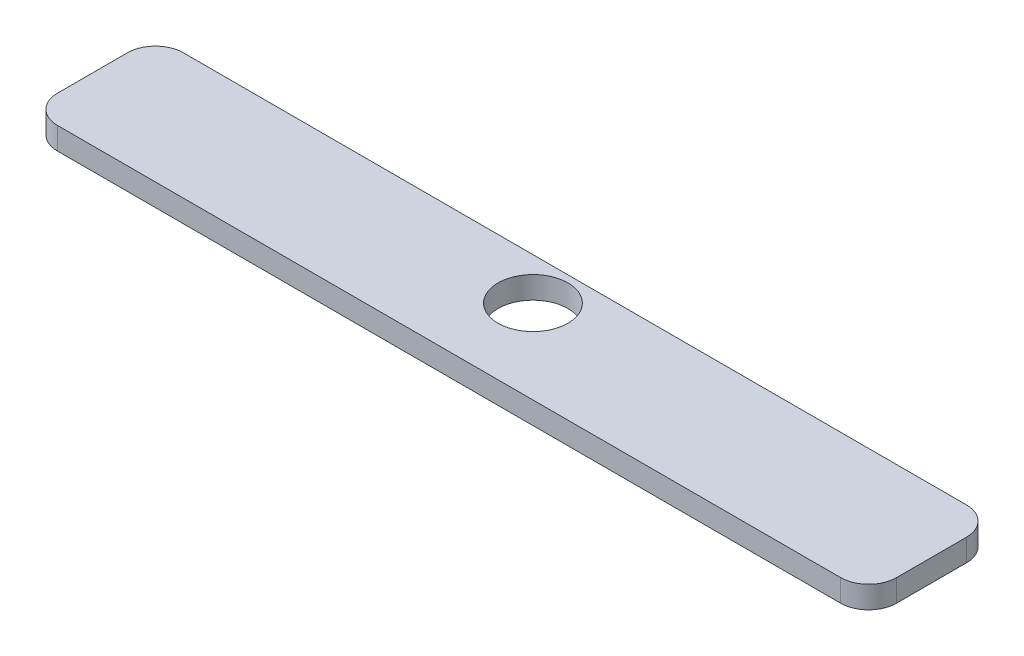
ISO-10303-21;
HEADER;
FILE_DESCRIPTION(('STEP AP214'),'2;1');
FILE_NAME('part.step','',(''),(''),'','','');
FILE_SCHEMA(('AUTOMOTIVE_DESIGN { 1 0 10303 214 1 1 1 1 }'));
ENDSEC;
DATA;
#1=APPLICATION_CONTEXT('core data for automotive mechanical design processes');
#2=APPLICATION_PROTOCOL_DEFINITION('international standard','automotive_design',2000,#1);
#3=PRODUCT_CONTEXT('',#1,'mechanical');
#4=PRODUCT('Part','Part','',(#3));
#5=PRODUCT_RELATED_PRODUCT_CATEGORY('part','',(#4));
#6=PRODUCT_DEFINITION_FORMATION('','',#4);
#7=PRODUCT_DEFINITION_CONTEXT('part definition',#1,'design');
#8=PRODUCT_DEFINITION('design','',#6,#7);
#9=PRODUCT_DEFINITION_SHAPE('','',#8);
#10=(LENGTH_UNIT() NAMED_UNIT(*) SI_UNIT(.MILLI.,.METRE.));
#11=(NAMED_UNIT(*) PLANE_ANGLE_UNIT() SI_UNIT($,.RADIAN.));
#12=(NAMED_UNIT(*) SI_UNIT($,.STERADIAN.) SOLID_ANGLE_UNIT());
#13=UNCERTAINTY_MEASURE_WITH_UNIT(LENGTH_MEASURE(1.E-05),#10,'distance_accuracy_value','');
#14=(GEOMETRIC_REPRESENTATION_CONTEXT(3) GLOBAL_UNCERTAINTY_ASSIGNED_CONTEXT((#13)) GLOBAL_UNIT_ASSIGNED_CONTEXT((#10,
#11,#12)) REPRESENTATION_CONTEXT('',''));
#15=CARTESIAN_POINT('',(0.,0.,0.));
#16=DIRECTION('',(0.,0.,1.));
#17=DIRECTION('',(1.,0.,0.));
#18=AXIS2_PLACEMENT_3D('',#15,#16,#17);
#19=CARTESIAN_POINT('',(0.,0.79375,0.));
#20=DIRECTION('',(0.,-1.,0.));
#21=DIRECTION('',(0.,0.,-1.));
#22=AXIS2_PLACEMENT_3D('',#19,#20,#21);
#23=PLANE('',#22);
#24=DIRECTION('',(0.,0.,-1.));
#25=VECTOR('',#24,1.);
#26=CARTESIAN_POINT('',(30.,0.79375,0.));
#27=LINE('',#26,#25);
#28=CARTESIAN_POINT('',(30.,0.79375,-1.));
#29=VERTEX_POINT('',#28);
#30=CARTESIAN_POINT('',(30.,0.79375,-3.5));
#31=VERTEX_POINT('',#30);
#32=EDGE_CURVE('E200',#29,#31,#27,.T.);
#33=ORIENTED_EDGE('',*,*,#32,.T.);
#34=CARTESIAN_POINT('',(29.,0.79375,-3.5));
#35=DIRECTION('',(0.,-1.,0.));
#36=DIRECTION('',(0.,0.,-1.));
#37=AXIS2_PLACEMENT_3D('',#34,#35,#36);
#38=CIRCLE('',#37,1.);
#39=CARTESIAN_POINT('',(29.,0.79375,-4.5));
#40=VERTEX_POINT('',#39);
#41=EDGE_CURVE('E169',#31,#40,#38,.F.);
#42=ORIENTED_EDGE('',*,*,#41,.T.);
#43=DIRECTION('',(-1.,0.,0.));
#44=VECTOR('',#43,1.);
#45=CARTESIAN_POINT('',(0.,0.79375,-4.5));
#46=LINE('',#45,#44);
#47=CARTESIAN_POINT('',(1.,0.79375,-4.5));
#48=VERTEX_POINT('',#47);
#49=EDGE_CURVE('E127',#40,#48,#46,.T.);
#50=ORIENTED_EDGE('',*,*,#49,.T.);
#51=CARTESIAN_POINT('',(1.,0.79375,-3.5));
#52=DIRECTION('',(0.,-1.,0.));
#53=DIRECTION('',(0.,0.,-1.));
#54=AXIS2_PLACEMENT_3D('',#51,#52,#53);
#55=CIRCLE('',#54,1.);
#56=CARTESIAN_POINT('',(0.,0.79375,-3.5));
#57=VERTEX_POINT('',#56);
#58=EDGE_CURVE('E161',#48,#57,#55,.F.);
#59=ORIENTED_EDGE('',*,*,#58,.T.);
#60=DIRECTION('',(0.,0.,1.));
#61=VECTOR('',#60,1.);
#62=CARTESIAN_POINT('',(0.,0.79375,0.));
#63=LINE('',#62,#61);
#64=CARTESIAN_POINT('',(0.,0.79375,-1.));
#65=VERTEX_POINT('',#64);
#66=EDGE_CURVE('E136',#57,#65,#63,.T.);
#67=ORIENTED_EDGE('',*,*,#66,.T.);
#68=CARTESIAN_POINT('',(1.,0.79375,-1.));
#69=DIRECTION('',(0.,-1.,0.));
#70=DIRECTION('',(0.,0.,-1.));
#71=AXIS2_PLACEMENT_3D('',#68,#69,#70);
#72=CIRCLE('',#71,1.);
#73=CARTESIAN_POINT('',(1.,0.79375,0.));
#74=VERTEX_POINT('',#73);
#75=EDGE_CURVE('E62',#65,#74,#72,.F.);
#76=ORIENTED_EDGE('',*,*,#75,.T.);
#77=DIRECTION('',(1.,0.,0.));
#78=VECTOR('',#77,1.);
#79=CARTESIAN_POINT('',(0.,0.79375,0.));
#80=LINE('',#79,#78);
#81=CARTESIAN_POINT('',(29.,0.79375,0.));
#82=VERTEX_POINT('',#81);
#83=EDGE_CURVE('E141',#74,#82,#80,.T.);
#84=ORIENTED_EDGE('',*,*,#83,.T.);
#85=CARTESIAN_POINT('',(29.,0.79375,-1.));
#86=DIRECTION('',(0.,-1.,0.));
#87=DIRECTION('',(0.,0.,-1.));
#88=AXIS2_PLACEMENT_3D('',#85,#86,#87);
#89=CIRCLE('',#88,1.);
#90=EDGE_CURVE('E166',#82,#29,#89,.F.);
#91=ORIENTED_EDGE('',*,*,#90,.T.);
#92=EDGE_LOOP('',(#33,#42,#50,#59,#67,#76,#84,#91));
#93=FACE_BOUND('',#92,.T.);
#94=CARTESIAN_POINT('',(15.,0.79375,-3.));
#95=DIRECTION('',(0.,1.,0.));
#96=DIRECTION('',(0.,0.,1.));
#97=AXIS2_PLACEMENT_3D('',#94,#95,#96);
#98=CIRCLE('',#97,1.25);
#99=CARTESIAN_POINT('',(15.,0.79375,-1.75));
#100=VERTEX_POINT('',#99);
#101=EDGE_CURVE('E190',#100,#100,#98,.T.);
#102=ORIENTED_EDGE('',*,*,#101,.F.);
#103=EDGE_LOOP('',(#102));
#104=FACE_BOUND('',#103,.T.);
#105=ADVANCED_FACE('F39',(#93,#104),#23,.F.);
#106=CARTESIAN_POINT('',(0.,0.,0.));
#107=DIRECTION('',(0.,-1.,0.));
#108=DIRECTION('',(0.,0.,-1.));
#109=AXIS2_PLACEMENT_3D('',#106,#107,#108);
#110=PLANE('',#109);
#111=DIRECTION('',(-1.,0.,0.));
#112=VECTOR('',#111,1.);
#113=CARTESIAN_POINT('',(0.,0.,-4.5));
#114=LINE('',#113,#112);
#115=CARTESIAN_POINT('',(29.,0.,-4.5));
#116=VERTEX_POINT('',#115);
#117=CARTESIAN_POINT('',(1.,0.,-4.5));
#118=VERTEX_POINT('',#117);
#119=EDGE_CURVE('E124',#116,#118,#114,.T.);
#120=ORIENTED_EDGE('',*,*,#119,.F.);
#121=CARTESIAN_POINT('',(29.,0.,-3.5));
#122=DIRECTION('',(0.,-1.,0.));
#123=DIRECTION('',(0.,0.,-1.));
#124=AXIS2_PLACEMENT_3D('',#121,#122,#123);
#125=CIRCLE('',#124,1.);
#126=CARTESIAN_POINT('',(30.,0.,-3.5));
#127=VERTEX_POINT('',#126);
#128=EDGE_CURVE('E106',#116,#127,#125,.T.);
#129=ORIENTED_EDGE('',*,*,#128,.T.);
#130=DIRECTION('',(0.,0.,-1.));
#131=VECTOR('',#130,1.);
#132=CARTESIAN_POINT('',(30.,0.,0.));
#133=LINE('',#132,#131);
#134=CARTESIAN_POINT('',(30.,0.,-1.));
#135=VERTEX_POINT('',#134);
#136=EDGE_CURVE('E137',#135,#127,#133,.T.);
#137=ORIENTED_EDGE('',*,*,#136,.F.);
#138=CARTESIAN_POINT('',(29.,0.,-1.));
#139=DIRECTION('',(0.,-1.,0.));
#140=DIRECTION('',(0.,0.,-1.));
#141=AXIS2_PLACEMENT_3D('',#138,#139,#140);
#142=CIRCLE('',#141,1.);
#143=CARTESIAN_POINT('',(29.,0.,0.));
#144=VERTEX_POINT('',#143);
#145=EDGE_CURVE('E118',#135,#144,#142,.T.);
#146=ORIENTED_EDGE('',*,*,#145,.T.);
#147=DIRECTION('',(1.,0.,0.));
#148=VECTOR('',#147,1.);
#149=CARTESIAN_POINT('',(0.,0.,0.));
#150=LINE('',#149,#148);
#151=CARTESIAN_POINT('',(1.,0.,0.));
#152=VERTEX_POINT('',#151);
#153=EDGE_CURVE('E143',#152,#144,#150,.T.);
#154=ORIENTED_EDGE('',*,*,#153,.F.);
#155=CARTESIAN_POINT('',(1.,0.,-1.));
#156=DIRECTION('',(0.,-1.,0.));
#157=DIRECTION('',(0.,0.,-1.));
#158=AXIS2_PLACEMENT_3D('',#155,#156,#157);
#159=CIRCLE('',#158,1.);
#160=CARTESIAN_POINT('',(0.,0.,-1.));
#161=VERTEX_POINT('',#160);
#162=EDGE_CURVE('E151',#152,#161,#159,.T.);
#163=ORIENTED_EDGE('',*,*,#162,.T.);
#164=DIRECTION('',(0.,0.,1.));
#165=VECTOR('',#164,1.);
#166=CARTESIAN_POINT('',(0.,0.,0.));
#167=LINE('',#166,#165);
#168=CARTESIAN_POINT('',(0.,0.,-3.5));
#169=VERTEX_POINT('',#168);
#170=EDGE_CURVE('E184',#169,#161,#167,.T.);
#171=ORIENTED_EDGE('',*,*,#170,.F.);
#172=CARTESIAN_POINT('',(1.,0.,-3.5));
#173=DIRECTION('',(0.,-1.,0.));
#174=DIRECTION('',(0.,0.,-1.));
#175=AXIS2_PLACEMENT_3D('',#172,#173,#174);
#176=CIRCLE('',#175,1.);
#177=EDGE_CURVE('E129',#169,#118,#176,.T.);
#178=ORIENTED_EDGE('',*,*,#177,.T.);
#179=EDGE_LOOP('',(#120,#129,#137,#146,#154,#163,#171,#178));
#180=FACE_BOUND('',#179,.T.);
#181=CARTESIAN_POINT('',(15.,0.,-3.));
#182=DIRECTION('',(0.,1.,0.));
#183=DIRECTION('',(0.,0.,1.));
#184=AXIS2_PLACEMENT_3D('',#181,#182,#183);
#185=CIRCLE('',#184,1.25);
#186=CARTESIAN_POINT('',(15.,0.,-1.75));
#187=VERTEX_POINT('',#186);
#188=EDGE_CURVE('E195',#187,#187,#185,.T.);
#189=ORIENTED_EDGE('',*,*,#188,.T.);
#190=EDGE_LOOP('',(#189));
#191=FACE_BOUND('',#190,.T.);
#192=ADVANCED_FACE('F132',(#180,#191),#110,.T.);
#193=CARTESIAN_POINT('',(0.,0.79375,0.));
#194=DIRECTION('',(1.,0.,0.));
#195=DIRECTION('',(0.,0.,-1.));
#196=AXIS2_PLACEMENT_3D('',#193,#194,#195);
#197=PLANE('',#196);
#198=ORIENTED_EDGE('',*,*,#170,.T.);
#199=DIRECTION('',(0.,-1.,0.));
#200=VECTOR('',#199,1.);
#201=CARTESIAN_POINT('',(0.,0.79375,-1.));
#202=LINE('',#201,#200);
#203=EDGE_CURVE('E11',#161,#65,#202,.F.);
#204=ORIENTED_EDGE('',*,*,#203,.T.);
#205=ORIENTED_EDGE('',*,*,#66,.F.);
#206=DIRECTION('',(0.,-1.,0.));
#207=VECTOR('',#206,1.);
#208=CARTESIAN_POINT('',(0.,0.79375,-3.5));
#209=LINE('',#208,#207);
#210=EDGE_CURVE('E48',#57,#169,#209,.T.);
#211=ORIENTED_EDGE('',*,*,#210,.T.);
#212=EDGE_LOOP('',(#198,#204,#205,#211));
#213=FACE_BOUND('',#212,.T.);
#214=ADVANCED_FACE('F183',(#213),#197,.F.);
#215=CARTESIAN_POINT('',(0.,0.79375,0.));
#216=DIRECTION('',(0.,0.,-1.));
#217=DIRECTION('',(-1.,0.,0.));
#218=AXIS2_PLACEMENT_3D('',#215,#216,#217);
#219=PLANE('',#218);
#220=ORIENTED_EDGE('',*,*,#153,.T.);
#221=DIRECTION('',(0.,-1.,0.));
#222=VECTOR('',#221,1.);
#223=CARTESIAN_POINT('',(29.,0.79375,0.));
#224=LINE('',#223,#222);
#225=EDGE_CURVE('E55',#144,#82,#224,.F.);
#226=ORIENTED_EDGE('',*,*,#225,.T.);
#227=ORIENTED_EDGE('',*,*,#83,.F.);
#228=DIRECTION('',(0.,-1.,0.));
#229=VECTOR('',#228,1.);
#230=CARTESIAN_POINT('',(1.,0.79375,0.));
#231=LINE('',#230,#229);
#232=EDGE_CURVE('E172',#74,#152,#231,.T.);
#233=ORIENTED_EDGE('',*,*,#232,.T.);
#234=EDGE_LOOP('',(#220,#226,#227,#233));
#235=FACE_BOUND('',#234,.T.);
#236=ADVANCED_FACE('F232',(#235),#219,.F.);
#237=CARTESIAN_POINT('',(30.,0.79375,0.));
#238=DIRECTION('',(-1.,0.,0.));
#239=DIRECTION('',(0.,0.,1.));
#240=AXIS2_PLACEMENT_3D('',#237,#238,#239);
#241=PLANE('',#240);
#242=ORIENTED_EDGE('',*,*,#136,.T.);
#243=DIRECTION('',(0.,-1.,0.));
#244=VECTOR('',#243,1.);
#245=CARTESIAN_POINT('',(30.,0.79375,-3.5));
#246=LINE('',#245,#244);
#247=EDGE_CURVE('E111',#127,#31,#246,.F.);
#248=ORIENTED_EDGE('',*,*,#247,.T.);
#249=ORIENTED_EDGE('',*,*,#32,.F.);
#250=DIRECTION('',(0.,-1.,0.));
#251=VECTOR('',#250,1.);
#252=CARTESIAN_POINT('',(30.,0.79375,-1.));
#253=LINE('',#252,#251);
#254=EDGE_CURVE('E117',#29,#135,#253,.T.);
#255=ORIENTED_EDGE('',*,*,#254,.T.);
#256=EDGE_LOOP('',(#242,#248,#249,#255));
#257=FACE_BOUND('',#256,.T.);
#258=ADVANCED_FACE('F220',(#257),#241,.F.);
#259=CARTESIAN_POINT('',(0.,0.79375,-4.5));
#260=DIRECTION('',(0.,0.,1.));
#261=DIRECTION('',(1.,0.,0.));
#262=AXIS2_PLACEMENT_3D('',#259,#260,#261);
#263=PLANE('',#262);
#264=ORIENTED_EDGE('',*,*,#49,.F.);
#265=DIRECTION('',(0.,-1.,0.));
#266=VECTOR('',#265,1.);
#267=CARTESIAN_POINT('',(29.,0.79375,-4.5));
#268=LINE('',#267,#266);
#269=EDGE_CURVE('E110',#40,#116,#268,.T.);
#270=ORIENTED_EDGE('',*,*,#269,.T.);
#271=ORIENTED_EDGE('',*,*,#119,.T.);
#272=DIRECTION('',(0.,-1.,0.));
#273=VECTOR('',#272,1.);
#274=CARTESIAN_POINT('',(1.,0.79375,-4.5));
#275=LINE('',#274,#273);
#276=EDGE_CURVE('E130',#118,#48,#275,.F.);
#277=ORIENTED_EDGE('',*,*,#276,.T.);
#278=EDGE_LOOP('',(#264,#270,#271,#277));
#279=FACE_BOUND('',#278,.T.);
#280=ADVANCED_FACE('F123',(#279),#263,.F.);
#281=CARTESIAN_POINT('',(15.,0.79375,-3.));
#282=DIRECTION('',(0.,-1.,0.));
#283=DIRECTION('',(0.,0.,-1.));
#284=AXIS2_PLACEMENT_3D('',#281,#282,#283);
#285=CYLINDRICAL_SURFACE('',#284,1.25);
#286=ORIENTED_EDGE('',*,*,#101,.T.);
#287=EDGE_LOOP('',(#286));
#288=FACE_BOUND('',#287,.T.);
#289=ORIENTED_EDGE('',*,*,#188,.F.);
#290=EDGE_LOOP('',(#289));
#291=FACE_BOUND('',#290,.T.);
#292=ADVANCED_FACE('F210',(#288,#291),#285,.F.);
#293=CARTESIAN_POINT('',(29.,0.79375,-3.5));
#294=DIRECTION('',(0.,-1.,0.));
#295=DIRECTION('',(0.,0.,-1.));
#296=AXIS2_PLACEMENT_3D('',#293,#294,#295);
#297=CYLINDRICAL_SURFACE('',#296,1.);
#298=ORIENTED_EDGE('',*,*,#41,.F.);
#299=ORIENTED_EDGE('',*,*,#247,.F.);
#300=ORIENTED_EDGE('',*,*,#128,.F.);
#301=ORIENTED_EDGE('',*,*,#269,.F.);
#302=EDGE_LOOP('',(#298,#299,#300,#301));
#303=FACE_BOUND('',#302,.T.);
#304=ADVANCED_FACE('F109',(#303),#297,.T.);
#305=CARTESIAN_POINT('',(29.,0.79375,-1.));
#306=DIRECTION('',(0.,-1.,0.));
#307=DIRECTION('',(0.,0.,-1.));
#308=AXIS2_PLACEMENT_3D('',#305,#306,#307);
#309=CYLINDRICAL_SURFACE('',#308,1.);
#310=ORIENTED_EDGE('',*,*,#90,.F.);
#311=ORIENTED_EDGE('',*,*,#225,.F.);
#312=ORIENTED_EDGE('',*,*,#145,.F.);
#313=ORIENTED_EDGE('',*,*,#254,.F.);
#314=EDGE_LOOP('',(#310,#311,#312,#313));
#315=FACE_BOUND('',#314,.T.);
#316=ADVANCED_FACE('F218',(#315),#309,.T.);
#317=CARTESIAN_POINT('',(1.,0.79375,-1.));
#318=DIRECTION('',(0.,-1.,0.));
#319=DIRECTION('',(0.,0.,-1.));
#320=AXIS2_PLACEMENT_3D('',#317,#318,#319);
#321=CYLINDRICAL_SURFACE('',#320,1.);
#322=ORIENTED_EDGE('',*,*,#75,.F.);
#323=ORIENTED_EDGE('',*,*,#203,.F.);
#324=ORIENTED_EDGE('',*,*,#162,.F.);
#325=ORIENTED_EDGE('',*,*,#232,.F.);
#326=EDGE_LOOP('',(#322,#323,#324,#325));
#327=FACE_BOUND('',#326,.T.);
#328=ADVANCED_FACE('F239',(#327),#321,.T.);
#329=CARTESIAN_POINT('',(1.,0.79375,-3.5));
#330=DIRECTION('',(0.,-1.,0.));
#331=DIRECTION('',(0.,0.,-1.));
#332=AXIS2_PLACEMENT_3D('',#329,#330,#331);
#333=CYLINDRICAL_SURFACE('',#332,1.);
#334=ORIENTED_EDGE('',*,*,#58,.F.);
#335=ORIENTED_EDGE('',*,*,#276,.F.);
#336=ORIENTED_EDGE('',*,*,#177,.F.);
#337=ORIENTED_EDGE('',*,*,#210,.F.);
#338=EDGE_LOOP('',(#334,#335,#336,#337));
#339=FACE_BOUND('',#338,.T.);
#340=ADVANCED_FACE('F41',(#339),#333,.T.);
#341=CLOSED_SHELL('',(#105,#192,#214,#236,#258,#280,#292,#304,#316,#328,#340));
#342=MANIFOLD_SOLID_BREP('B2',#341);
#343=ADVANCED_BREP_SHAPE_REPRESENTATION('',(#18,#342),#14);
#344=SHAPE_DEFINITION_REPRESENTATION(#9,#343);
ENDSEC;
END-ISO-10303-21;
